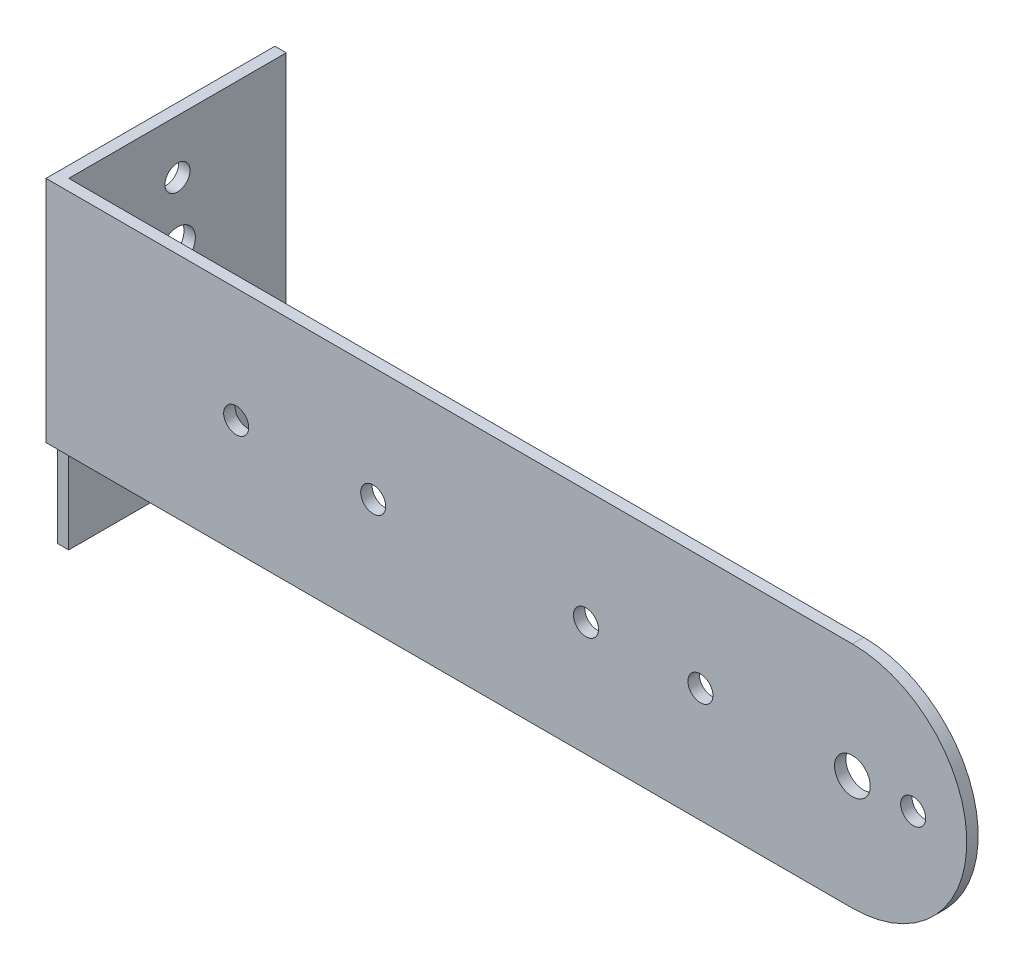
ISO-10303-21;
HEADER;
FILE_DESCRIPTION(('STEP AP214'),'2;1');
FILE_NAME('part.step','',(''),(''),'','','');
FILE_SCHEMA(('AUTOMOTIVE_DESIGN { 1 0 10303 214 1 1 1 1 }'));
ENDSEC;
DATA;
#1=APPLICATION_CONTEXT('core data for automotive mechanical design processes');
#2=APPLICATION_PROTOCOL_DEFINITION('international standard','automotive_design',2000,#1);
#3=PRODUCT_CONTEXT('',#1,'mechanical');
#4=PRODUCT('Part','Part','',(#3));
#5=PRODUCT_RELATED_PRODUCT_CATEGORY('part','',(#4));
#6=PRODUCT_DEFINITION_FORMATION('','',#4);
#7=PRODUCT_DEFINITION_CONTEXT('part definition',#1,'design');
#8=PRODUCT_DEFINITION('design','',#6,#7);
#9=PRODUCT_DEFINITION_SHAPE('','',#8);
#10=(LENGTH_UNIT() NAMED_UNIT(*) SI_UNIT(.MILLI.,.METRE.));
#11=(NAMED_UNIT(*) PLANE_ANGLE_UNIT() SI_UNIT($,.RADIAN.));
#12=(NAMED_UNIT(*) SI_UNIT($,.STERADIAN.) SOLID_ANGLE_UNIT());
#13=UNCERTAINTY_MEASURE_WITH_UNIT(LENGTH_MEASURE(1.E-05),#10,'distance_accuracy_value','');
#14=(GEOMETRIC_REPRESENTATION_CONTEXT(3) GLOBAL_UNCERTAINTY_ASSIGNED_CONTEXT((#13)) GLOBAL_UNIT_ASSIGNED_CONTEXT((#10,
#11,#12)) REPRESENTATION_CONTEXT('',''));
#15=CARTESIAN_POINT('',(0.,0.,0.));
#16=DIRECTION('',(0.,0.,1.));
#17=DIRECTION('',(1.,0.,0.));
#18=AXIS2_PLACEMENT_3D('',#15,#16,#17);
#19=CARTESIAN_POINT('',(0.,0.,0.));
#20=DIRECTION('',(0.,0.,1.));
#21=DIRECTION('',(1.,0.,0.));
#22=AXIS2_PLACEMENT_3D('',#19,#20,#21);
#23=PLANE('',#22);
#24=CARTESIAN_POINT('',(-37.25,0.,0.));
#25=DIRECTION('',(0.,0.,-1.));
#26=DIRECTION('',(-1.,0.,0.));
#27=AXIS2_PLACEMENT_3D('',#24,#25,#26);
#28=CIRCLE('',#27,1.75);
#29=CARTESIAN_POINT('',(-39.,0.,0.));
#30=VERTEX_POINT('',#29);
#31=EDGE_CURVE('E196',#30,#30,#28,.T.);
#32=ORIENTED_EDGE('',*,*,#31,.F.);
#33=EDGE_LOOP('',(#32));
#34=FACE_BOUND('',#33,.T.);
#35=CARTESIAN_POINT('',(-67.,0.,0.));
#36=DIRECTION('',(0.,0.,-1.));
#37=DIRECTION('',(-1.,0.,0.));
#38=AXIS2_PLACEMENT_3D('',#35,#36,#37);
#39=CIRCLE('',#38,1.75);
#40=CARTESIAN_POINT('',(-68.75,0.,0.));
#41=VERTEX_POINT('',#40);
#42=EDGE_CURVE('E202',#41,#41,#39,.T.);
#43=ORIENTED_EDGE('',*,*,#42,.F.);
#44=EDGE_LOOP('',(#43));
#45=FACE_BOUND('',#44,.T.);
#46=CARTESIAN_POINT('',(8.5,0.,0.));
#47=DIRECTION('',(0.,0.,-1.));
#48=DIRECTION('',(-1.,0.,0.));
#49=AXIS2_PLACEMENT_3D('',#46,#47,#48);
#50=CIRCLE('',#49,1.75);
#51=CARTESIAN_POINT('',(6.75,0.,0.));
#52=VERTEX_POINT('',#51);
#53=EDGE_CURVE('E208',#52,#52,#50,.T.);
#54=ORIENTED_EDGE('',*,*,#53,.F.);
#55=EDGE_LOOP('',(#54));
#56=FACE_BOUND('',#55,.T.);
#57=CARTESIAN_POINT('',(0.,0.,0.));
#58=DIRECTION('',(0.,0.,-1.));
#59=DIRECTION('',(-1.,0.,0.));
#60=AXIS2_PLACEMENT_3D('',#57,#58,#59);
#61=CIRCLE('',#60,2.5);
#62=CARTESIAN_POINT('',(-2.5,0.,0.));
#63=VERTEX_POINT('',#62);
#64=EDGE_CURVE('E214',#63,#63,#61,.T.);
#65=ORIENTED_EDGE('',*,*,#64,.F.);
#66=EDGE_LOOP('',(#65));
#67=FACE_BOUND('',#66,.T.);
#68=CARTESIAN_POINT('',(-21.25,0.,0.));
#69=DIRECTION('',(0.,0.,-1.));
#70=DIRECTION('',(-1.,0.,0.));
#71=AXIS2_PLACEMENT_3D('',#68,#69,#70);
#72=CIRCLE('',#71,1.75);
#73=CARTESIAN_POINT('',(-23.,0.,0.));
#74=VERTEX_POINT('',#73);
#75=EDGE_CURVE('E175',#74,#74,#72,.T.);
#76=ORIENTED_EDGE('',*,*,#75,.F.);
#77=EDGE_LOOP('',(#76));
#78=FACE_BOUND('',#77,.T.);
#79=CARTESIAN_POINT('',(-86.1600000000001,0.,0.));
#80=DIRECTION('',(0.,0.,-1.));
#81=DIRECTION('',(-1.,0.,0.));
#82=AXIS2_PLACEMENT_3D('',#79,#80,#81);
#83=CIRCLE('',#82,1.75);
#84=CARTESIAN_POINT('',(-87.9100000000001,0.,0.));
#85=VERTEX_POINT('',#84);
#86=EDGE_CURVE('E141',#85,#85,#83,.T.);
#87=ORIENTED_EDGE('',*,*,#86,.F.);
#88=EDGE_LOOP('',(#87));
#89=FACE_BOUND('',#88,.T.);
#90=DIRECTION('',(0.,-1.,0.));
#91=VECTOR('',#90,1.);
#92=CARTESIAN_POINT('',(-111.16,16.,0.));
#93=LINE('',#92,#91);
#94=CARTESIAN_POINT('',(-111.16,16.,0.));
#95=VERTEX_POINT('',#94);
#96=CARTESIAN_POINT('',(-111.16,-16.,0.));
#97=VERTEX_POINT('',#96);
#98=EDGE_CURVE('E60',#95,#97,#93,.T.);
#99=ORIENTED_EDGE('',*,*,#98,.F.);
#100=DIRECTION('',(-1.,0.,0.));
#101=VECTOR('',#100,1.);
#102=CARTESIAN_POINT('',(0.,16.,0.));
#103=LINE('',#102,#101);
#104=CARTESIAN_POINT('',(0.,16.,0.));
#105=VERTEX_POINT('',#104);
#106=EDGE_CURVE('E168',#105,#95,#103,.T.);
#107=ORIENTED_EDGE('',*,*,#106,.F.);
#108=CARTESIAN_POINT('',(0.,0.,0.));
#109=DIRECTION('',(0.,0.,1.));
#110=DIRECTION('',(1.,0.,0.));
#111=AXIS2_PLACEMENT_3D('',#108,#109,#110);
#112=CIRCLE('',#111,16.);
#113=CARTESIAN_POINT('',(0.,-16.,0.));
#114=VERTEX_POINT('',#113);
#115=EDGE_CURVE('E158',#114,#105,#112,.T.);
#116=ORIENTED_EDGE('',*,*,#115,.F.);
#117=DIRECTION('',(1.,0.,0.));
#118=VECTOR('',#117,1.);
#119=CARTESIAN_POINT('',(-112.75,-16.,0.));
#120=LINE('',#119,#118);
#121=EDGE_CURVE('E85',#97,#114,#120,.T.);
#122=ORIENTED_EDGE('',*,*,#121,.F.);
#123=EDGE_LOOP('',(#99,#107,#116,#122));
#124=FACE_BOUND('',#123,.T.);
#125=ADVANCED_FACE('F43',(#34,#45,#56,#67,#78,#89,#124),#23,.F.);
#126=CARTESIAN_POINT('',(0.,0.,1.59));
#127=DIRECTION('',(0.,0.,-1.));
#128=DIRECTION('',(-1.,0.,0.));
#129=AXIS2_PLACEMENT_3D('',#126,#127,#128);
#130=CYLINDRICAL_SURFACE('',#129,16.);
#131=ORIENTED_EDGE('',*,*,#115,.T.);
#132=DIRECTION('',(0.,0.,-1.));
#133=VECTOR('',#132,1.);
#134=CARTESIAN_POINT('',(0.,16.,1.59));
#135=LINE('',#134,#133);
#136=CARTESIAN_POINT('',(0.,16.,1.59));
#137=VERTEX_POINT('',#136);
#138=EDGE_CURVE('E13',#137,#105,#135,.T.);
#139=ORIENTED_EDGE('',*,*,#138,.F.);
#140=CARTESIAN_POINT('',(0.,0.,1.59));
#141=DIRECTION('',(0.,0.,1.));
#142=DIRECTION('',(1.,0.,0.));
#143=AXIS2_PLACEMENT_3D('',#140,#141,#142);
#144=CIRCLE('',#143,16.);
#145=CARTESIAN_POINT('',(0.,-16.,1.59));
#146=VERTEX_POINT('',#145);
#147=EDGE_CURVE('E159',#146,#137,#144,.T.);
#148=ORIENTED_EDGE('',*,*,#147,.F.);
#149=DIRECTION('',(0.,0.,-1.));
#150=VECTOR('',#149,1.);
#151=CARTESIAN_POINT('',(0.,-16.,1.59));
#152=LINE('',#151,#150);
#153=EDGE_CURVE('E165',#146,#114,#152,.T.);
#154=ORIENTED_EDGE('',*,*,#153,.T.);
#155=EDGE_LOOP('',(#131,#139,#148,#154));
#156=FACE_BOUND('',#155,.T.);
#157=ADVANCED_FACE('F45',(#156),#130,.T.);
#158=CARTESIAN_POINT('',(0.,16.,1.59));
#159=DIRECTION('',(0.,-1.,0.));
#160=DIRECTION('',(0.,0.,-1.));
#161=AXIS2_PLACEMENT_3D('',#158,#159,#160);
#162=PLANE('',#161);
#163=ORIENTED_EDGE('',*,*,#106,.T.);
#164=DIRECTION('',(0.,0.,1.));
#165=VECTOR('',#164,1.);
#166=CARTESIAN_POINT('',(-111.16,16.,-30.41));
#167=LINE('',#166,#165);
#168=CARTESIAN_POINT('',(-111.16,16.,-30.41));
#169=VERTEX_POINT('',#168);
#170=EDGE_CURVE('E128',#169,#95,#167,.T.);
#171=ORIENTED_EDGE('',*,*,#170,.F.);
#172=DIRECTION('',(1.,0.,0.));
#173=VECTOR('',#172,1.);
#174=CARTESIAN_POINT('',(-112.75,16.,-30.41));
#175=LINE('',#174,#173);
#176=CARTESIAN_POINT('',(-112.75,16.,-30.41));
#177=VERTEX_POINT('',#176);
#178=EDGE_CURVE('E125',#177,#169,#175,.T.);
#179=ORIENTED_EDGE('',*,*,#178,.F.);
#180=DIRECTION('',(0.,0.,-1.));
#181=VECTOR('',#180,1.);
#182=CARTESIAN_POINT('',(-112.75,16.,1.59));
#183=LINE('',#182,#181);
#184=CARTESIAN_POINT('',(-112.75,16.,1.59));
#185=VERTEX_POINT('',#184);
#186=EDGE_CURVE('E52',#185,#177,#183,.T.);
#187=ORIENTED_EDGE('',*,*,#186,.F.);
#188=DIRECTION('',(-1.,0.,0.));
#189=VECTOR('',#188,1.);
#190=CARTESIAN_POINT('',(0.,16.,1.59));
#191=LINE('',#190,#189);
#192=EDGE_CURVE('E92',#137,#185,#191,.T.);
#193=ORIENTED_EDGE('',*,*,#192,.F.);
#194=ORIENTED_EDGE('',*,*,#138,.T.);
#195=EDGE_LOOP('',(#163,#171,#179,#187,#193,#194));
#196=FACE_BOUND('',#195,.T.);
#197=ADVANCED_FACE('F126',(#196),#162,.F.);
#198=CARTESIAN_POINT('',(-112.75,16.,1.59));
#199=DIRECTION('',(1.,0.,0.));
#200=DIRECTION('',(0.,0.,-1.));
#201=AXIS2_PLACEMENT_3D('',#198,#199,#200);
#202=PLANE('',#201);
#203=CARTESIAN_POINT('',(-112.75,8.5,-15.205));
#204=DIRECTION('',(-1.,0.,0.));
#205=DIRECTION('',(0.,0.,1.));
#206=AXIS2_PLACEMENT_3D('',#203,#204,#205);
#207=CIRCLE('',#206,1.75);
#208=CARTESIAN_POINT('',(-112.75,8.5,-13.455));
#209=VERTEX_POINT('',#208);
#210=EDGE_CURVE('E179',#209,#209,#207,.T.);
#211=ORIENTED_EDGE('',*,*,#210,.F.);
#212=EDGE_LOOP('',(#211));
#213=FACE_BOUND('',#212,.T.);
#214=CARTESIAN_POINT('',(-112.75,-21.25,-15.205));
#215=DIRECTION('',(-1.,0.,0.));
#216=DIRECTION('',(0.,0.,1.));
#217=AXIS2_PLACEMENT_3D('',#214,#215,#216);
#218=CIRCLE('',#217,1.75);
#219=CARTESIAN_POINT('',(-112.75,-21.25,-13.455));
#220=VERTEX_POINT('',#219);
#221=EDGE_CURVE('E184',#220,#220,#218,.T.);
#222=ORIENTED_EDGE('',*,*,#221,.F.);
#223=EDGE_LOOP('',(#222));
#224=FACE_BOUND('',#223,.T.);
#225=CARTESIAN_POINT('',(-112.75,0.,-15.205));
#226=DIRECTION('',(-1.,0.,0.));
#227=DIRECTION('',(0.,0.,1.));
#228=AXIS2_PLACEMENT_3D('',#225,#226,#227);
#229=CIRCLE('',#228,2.5);
#230=CARTESIAN_POINT('',(-112.75,0.,-12.705));
#231=VERTEX_POINT('',#230);
#232=EDGE_CURVE('E176',#231,#231,#229,.T.);
#233=ORIENTED_EDGE('',*,*,#232,.F.);
#234=EDGE_LOOP('',(#233));
#235=FACE_BOUND('',#234,.T.);
#236=ORIENTED_EDGE('',*,*,#186,.T.);
#237=DIRECTION('',(0.,1.,0.));
#238=VECTOR('',#237,1.);
#239=CARTESIAN_POINT('',(-112.75,16.,-30.41));
#240=LINE('',#239,#238);
#241=CARTESIAN_POINT('',(-112.75,-29.,-30.41));
#242=VERTEX_POINT('',#241);
#243=EDGE_CURVE('E119',#242,#177,#240,.T.);
#244=ORIENTED_EDGE('',*,*,#243,.F.);
#245=DIRECTION('',(0.,0.,1.));
#246=VECTOR('',#245,1.);
#247=CARTESIAN_POINT('',(-112.75,-29.,-30.41));
#248=LINE('',#247,#246);
#249=CARTESIAN_POINT('',(-112.75,-29.,0.));
#250=VERTEX_POINT('',#249);
#251=EDGE_CURVE('E146',#242,#250,#248,.T.);
#252=ORIENTED_EDGE('',*,*,#251,.T.);
#253=DIRECTION('',(0.,1.,0.));
#254=VECTOR('',#253,1.);
#255=CARTESIAN_POINT('',(-112.75,16.,0.));
#256=LINE('',#255,#254);
#257=CARTESIAN_POINT('',(-112.75,-16.,0.));
#258=VERTEX_POINT('',#257);
#259=EDGE_CURVE('E147',#250,#258,#256,.T.);
#260=ORIENTED_EDGE('',*,*,#259,.T.);
#261=DIRECTION('',(0.,0.,-1.));
#262=VECTOR('',#261,1.);
#263=CARTESIAN_POINT('',(-112.75,-16.,1.59));
#264=LINE('',#263,#262);
#265=CARTESIAN_POINT('',(-112.75,-16.,1.59));
#266=VERTEX_POINT('',#265);
#267=EDGE_CURVE('E122',#266,#258,#264,.T.);
#268=ORIENTED_EDGE('',*,*,#267,.F.);
#269=DIRECTION('',(0.,-1.,0.));
#270=VECTOR('',#269,1.);
#271=CARTESIAN_POINT('',(-112.75,16.,1.59));
#272=LINE('',#271,#270);
#273=EDGE_CURVE('E121',#185,#266,#272,.T.);
#274=ORIENTED_EDGE('',*,*,#273,.F.);
#275=EDGE_LOOP('',(#236,#244,#252,#260,#268,#274));
#276=FACE_BOUND('',#275,.T.);
#277=ADVANCED_FACE('F116',(#213,#224,#235,#276),#202,.F.);
#278=CARTESIAN_POINT('',(-112.75,-16.,1.59));
#279=DIRECTION('',(0.,1.,0.));
#280=DIRECTION('',(0.,0.,1.));
#281=AXIS2_PLACEMENT_3D('',#278,#279,#280);
#282=PLANE('',#281);
#283=EDGE_CURVE('E161',#258,#97,#120,.T.);
#284=ORIENTED_EDGE('',*,*,#283,.T.);
#285=ORIENTED_EDGE('',*,*,#121,.T.);
#286=ORIENTED_EDGE('',*,*,#153,.F.);
#287=DIRECTION('',(1.,0.,0.));
#288=VECTOR('',#287,1.);
#289=CARTESIAN_POINT('',(-112.75,-16.,1.59));
#290=LINE('',#289,#288);
#291=EDGE_CURVE('E69',#266,#146,#290,.T.);
#292=ORIENTED_EDGE('',*,*,#291,.F.);
#293=ORIENTED_EDGE('',*,*,#267,.T.);
#294=EDGE_LOOP('',(#284,#285,#286,#292,#293));
#295=FACE_BOUND('',#294,.T.);
#296=ADVANCED_FACE('F242',(#295),#282,.F.);
#297=CARTESIAN_POINT('',(0.,0.,1.59));
#298=DIRECTION('',(0.,0.,1.));
#299=DIRECTION('',(1.,0.,0.));
#300=AXIS2_PLACEMENT_3D('',#297,#298,#299);
#301=PLANE('',#300);
#302=CARTESIAN_POINT('',(-37.25,0.,1.59));
#303=DIRECTION('',(0.,0.,-1.));
#304=DIRECTION('',(-1.,0.,0.));
#305=AXIS2_PLACEMENT_3D('',#302,#303,#304);
#306=CIRCLE('',#305,1.75);
#307=CARTESIAN_POINT('',(-39.,0.,1.59));
#308=VERTEX_POINT('',#307);
#309=EDGE_CURVE('E193',#308,#308,#306,.T.);
#310=ORIENTED_EDGE('',*,*,#309,.T.);
#311=EDGE_LOOP('',(#310));
#312=FACE_BOUND('',#311,.T.);
#313=CARTESIAN_POINT('',(-67.,0.,1.59));
#314=DIRECTION('',(0.,0.,-1.));
#315=DIRECTION('',(-1.,0.,0.));
#316=AXIS2_PLACEMENT_3D('',#313,#314,#315);
#317=CIRCLE('',#316,1.75);
#318=CARTESIAN_POINT('',(-68.75,0.,1.59));
#319=VERTEX_POINT('',#318);
#320=EDGE_CURVE('E199',#319,#319,#317,.T.);
#321=ORIENTED_EDGE('',*,*,#320,.T.);
#322=EDGE_LOOP('',(#321));
#323=FACE_BOUND('',#322,.T.);
#324=CARTESIAN_POINT('',(8.5,0.,1.59));
#325=DIRECTION('',(0.,0.,-1.));
#326=DIRECTION('',(-1.,0.,0.));
#327=AXIS2_PLACEMENT_3D('',#324,#325,#326);
#328=CIRCLE('',#327,1.75);
#329=CARTESIAN_POINT('',(6.75,0.,1.59));
#330=VERTEX_POINT('',#329);
#331=EDGE_CURVE('E205',#330,#330,#328,.T.);
#332=ORIENTED_EDGE('',*,*,#331,.T.);
#333=EDGE_LOOP('',(#332));
#334=FACE_BOUND('',#333,.T.);
#335=CARTESIAN_POINT('',(0.,0.,1.59));
#336=DIRECTION('',(0.,0.,-1.));
#337=DIRECTION('',(-1.,0.,0.));
#338=AXIS2_PLACEMENT_3D('',#335,#336,#337);
#339=CIRCLE('',#338,2.5);
#340=CARTESIAN_POINT('',(-2.5,0.,1.59));
#341=VERTEX_POINT('',#340);
#342=EDGE_CURVE('E211',#341,#341,#339,.T.);
#343=ORIENTED_EDGE('',*,*,#342,.T.);
#344=EDGE_LOOP('',(#343));
#345=FACE_BOUND('',#344,.T.);
#346=CARTESIAN_POINT('',(-21.25,0.,1.59));
#347=DIRECTION('',(0.,0.,-1.));
#348=DIRECTION('',(-1.,0.,0.));
#349=AXIS2_PLACEMENT_3D('',#346,#347,#348);
#350=CIRCLE('',#349,1.75);
#351=CARTESIAN_POINT('',(-23.,0.,1.59));
#352=VERTEX_POINT('',#351);
#353=EDGE_CURVE('E217',#352,#352,#350,.T.);
#354=ORIENTED_EDGE('',*,*,#353,.T.);
#355=EDGE_LOOP('',(#354));
#356=FACE_BOUND('',#355,.T.);
#357=CARTESIAN_POINT('',(-86.1600000000001,0.,1.59));
#358=DIRECTION('',(0.,0.,-1.));
#359=DIRECTION('',(-1.,0.,0.));
#360=AXIS2_PLACEMENT_3D('',#357,#358,#359);
#361=CIRCLE('',#360,1.75);
#362=CARTESIAN_POINT('',(-87.9100000000001,0.,1.59));
#363=VERTEX_POINT('',#362);
#364=EDGE_CURVE('E151',#363,#363,#361,.T.);
#365=ORIENTED_EDGE('',*,*,#364,.T.);
#366=EDGE_LOOP('',(#365));
#367=FACE_BOUND('',#366,.T.);
#368=ORIENTED_EDGE('',*,*,#147,.T.);
#369=ORIENTED_EDGE('',*,*,#192,.T.);
#370=ORIENTED_EDGE('',*,*,#273,.T.);
#371=ORIENTED_EDGE('',*,*,#291,.T.);
#372=EDGE_LOOP('',(#368,#369,#370,#371));
#373=FACE_BOUND('',#372,.T.);
#374=ADVANCED_FACE('F240',(#312,#323,#334,#345,#356,#367,#373),#301,.T.);
#375=CARTESIAN_POINT('',(0.,0.,0.));
#376=DIRECTION('',(0.,0.,1.));
#377=DIRECTION('',(1.,0.,0.));
#378=AXIS2_PLACEMENT_3D('',#375,#376,#377);
#379=PLANE('',#378);
#380=ORIENTED_EDGE('',*,*,#283,.F.);
#381=ORIENTED_EDGE('',*,*,#259,.F.);
#382=DIRECTION('',(-1.,0.,0.));
#383=VECTOR('',#382,1.);
#384=CARTESIAN_POINT('',(-112.75,-29.,0.));
#385=LINE('',#384,#383);
#386=CARTESIAN_POINT('',(-111.16,-29.,0.));
#387=VERTEX_POINT('',#386);
#388=EDGE_CURVE('E137',#387,#250,#385,.T.);
#389=ORIENTED_EDGE('',*,*,#388,.F.);
#390=EDGE_CURVE('E150',#97,#387,#93,.T.);
#391=ORIENTED_EDGE('',*,*,#390,.F.);
#392=EDGE_LOOP('',(#380,#381,#389,#391));
#393=FACE_BOUND('',#392,.T.);
#394=ADVANCED_FACE('F269',(#393),#379,.T.);
#395=CARTESIAN_POINT('',(-111.16,16.,-30.41));
#396=DIRECTION('',(-1.,0.,0.));
#397=DIRECTION('',(0.,-1.,0.));
#398=AXIS2_PLACEMENT_3D('',#395,#396,#397);
#399=PLANE('',#398);
#400=CARTESIAN_POINT('',(-111.16,8.5,-15.205));
#401=DIRECTION('',(-1.,0.,0.));
#402=DIRECTION('',(0.,-1.,0.));
#403=AXIS2_PLACEMENT_3D('',#400,#401,#402);
#404=CIRCLE('',#403,1.75);
#405=CARTESIAN_POINT('',(-111.16,6.75,-15.205));
#406=VERTEX_POINT('',#405);
#407=EDGE_CURVE('E47',#406,#406,#404,.T.);
#408=ORIENTED_EDGE('',*,*,#407,.T.);
#409=EDGE_LOOP('',(#408));
#410=FACE_BOUND('',#409,.T.);
#411=CARTESIAN_POINT('',(-111.16,-21.25,-15.205));
#412=DIRECTION('',(-1.,0.,0.));
#413=DIRECTION('',(0.,-1.,0.));
#414=AXIS2_PLACEMENT_3D('',#411,#412,#413);
#415=CIRCLE('',#414,1.75);
#416=CARTESIAN_POINT('',(-111.16,-23.,-15.205));
#417=VERTEX_POINT('',#416);
#418=EDGE_CURVE('E177',#417,#417,#415,.T.);
#419=ORIENTED_EDGE('',*,*,#418,.T.);
#420=EDGE_LOOP('',(#419));
#421=FACE_BOUND('',#420,.T.);
#422=CARTESIAN_POINT('',(-111.16,0.,-15.205));
#423=DIRECTION('',(-1.,0.,0.));
#424=DIRECTION('',(0.,-1.,0.));
#425=AXIS2_PLACEMENT_3D('',#422,#423,#424);
#426=CIRCLE('',#425,2.5);
#427=CARTESIAN_POINT('',(-111.16,-2.5,-15.205));
#428=VERTEX_POINT('',#427);
#429=EDGE_CURVE('E173',#428,#428,#426,.T.);
#430=ORIENTED_EDGE('',*,*,#429,.T.);
#431=EDGE_LOOP('',(#430));
#432=FACE_BOUND('',#431,.T.);
#433=ORIENTED_EDGE('',*,*,#98,.T.);
#434=ORIENTED_EDGE('',*,*,#390,.T.);
#435=DIRECTION('',(0.,0.,1.));
#436=VECTOR('',#435,1.);
#437=CARTESIAN_POINT('',(-111.16,-29.,-30.41));
#438=LINE('',#437,#436);
#439=CARTESIAN_POINT('',(-111.16,-29.,-30.41));
#440=VERTEX_POINT('',#439);
#441=EDGE_CURVE('E154',#440,#387,#438,.T.);
#442=ORIENTED_EDGE('',*,*,#441,.F.);
#443=DIRECTION('',(0.,-1.,0.));
#444=VECTOR('',#443,1.);
#445=CARTESIAN_POINT('',(-111.16,16.,-30.41));
#446=LINE('',#445,#444);
#447=EDGE_CURVE('E131',#169,#440,#446,.T.);
#448=ORIENTED_EDGE('',*,*,#447,.F.);
#449=ORIENTED_EDGE('',*,*,#170,.T.);
#450=EDGE_LOOP('',(#433,#434,#442,#448,#449));
#451=FACE_BOUND('',#450,.T.);
#452=ADVANCED_FACE('F276',(#410,#421,#432,#451),#399,.F.);
#453=CARTESIAN_POINT('',(-112.75,-29.,-30.41));
#454=DIRECTION('',(0.,1.,0.));
#455=DIRECTION('',(0.,0.,1.));
#456=AXIS2_PLACEMENT_3D('',#453,#454,#455);
#457=PLANE('',#456);
#458=ORIENTED_EDGE('',*,*,#388,.T.);
#459=ORIENTED_EDGE('',*,*,#251,.F.);
#460=DIRECTION('',(-1.,0.,0.));
#461=VECTOR('',#460,1.);
#462=CARTESIAN_POINT('',(-112.75,-29.,-30.41));
#463=LINE('',#462,#461);
#464=EDGE_CURVE('E135',#440,#242,#463,.T.);
#465=ORIENTED_EDGE('',*,*,#464,.F.);
#466=ORIENTED_EDGE('',*,*,#441,.T.);
#467=EDGE_LOOP('',(#458,#459,#465,#466));
#468=FACE_BOUND('',#467,.T.);
#469=ADVANCED_FACE('F284',(#468),#457,.F.);
#470=CARTESIAN_POINT('',(0.,0.,-30.41));
#471=DIRECTION('',(0.,0.,1.));
#472=DIRECTION('',(1.,0.,0.));
#473=AXIS2_PLACEMENT_3D('',#470,#471,#472);
#474=PLANE('',#473);
#475=ORIENTED_EDGE('',*,*,#243,.T.);
#476=ORIENTED_EDGE('',*,*,#178,.T.);
#477=ORIENTED_EDGE('',*,*,#447,.T.);
#478=ORIENTED_EDGE('',*,*,#464,.T.);
#479=EDGE_LOOP('',(#475,#476,#477,#478));
#480=FACE_BOUND('',#479,.T.);
#481=ADVANCED_FACE('F133',(#480),#474,.F.);
#482=CARTESIAN_POINT('',(-86.1600000000001,0.,1.59));
#483=DIRECTION('',(0.,0.,-1.));
#484=DIRECTION('',(-1.,0.,0.));
#485=AXIS2_PLACEMENT_3D('',#482,#483,#484);
#486=CYLINDRICAL_SURFACE('',#485,1.75);
#487=CARTESIAN_POINT('',(-87.9100000000001,0.,1.59));
#488=CARTESIAN_POINT('',(-87.9100000000001,0.,1.5734375));
#489=CARTESIAN_POINT('',(-87.9100000000001,0.,1.556875));
#490=CARTESIAN_POINT('',(-87.9100000000001,0.,1.52375));
#491=CARTESIAN_POINT('',(-87.9100000000001,0.,1.5071875));
#492=CARTESIAN_POINT('',(-87.9100000000001,0.,1.4740625));
#493=CARTESIAN_POINT('',(-87.9100000000001,0.,1.4575));
#494=CARTESIAN_POINT('',(-87.9100000000001,0.,1.424375));
#495=CARTESIAN_POINT('',(-87.9100000000001,0.,1.4078125));
#496=CARTESIAN_POINT('',(-87.9100000000001,0.,1.3746875));
#497=CARTESIAN_POINT('',(-87.9100000000001,0.,1.358125));
#498=CARTESIAN_POINT('',(-87.9100000000001,0.,1.325));
#499=CARTESIAN_POINT('',(-87.9100000000001,0.,1.3084375));
#500=CARTESIAN_POINT('',(-87.9100000000001,0.,1.2753125));
#501=CARTESIAN_POINT('',(-87.9100000000001,0.,1.25875));
#502=CARTESIAN_POINT('',(-87.9100000000001,0.,1.225625));
#503=CARTESIAN_POINT('',(-87.9100000000001,0.,1.2090625));
#504=CARTESIAN_POINT('',(-87.9100000000001,0.,1.1759375));
#505=CARTESIAN_POINT('',(-87.9100000000001,0.,1.159375));
#506=CARTESIAN_POINT('',(-87.9100000000001,0.,1.12625));
#507=CARTESIAN_POINT('',(-87.9100000000001,0.,1.1096875));
#508=CARTESIAN_POINT('',(-87.9100000000001,0.,1.0765625));
#509=CARTESIAN_POINT('',(-87.9100000000001,0.,1.06));
#510=CARTESIAN_POINT('',(-87.9100000000001,0.,1.026875));
#511=CARTESIAN_POINT('',(-87.9100000000001,0.,1.0103125));
#512=CARTESIAN_POINT('',(-87.9100000000001,0.,0.9771875));
#513=CARTESIAN_POINT('',(-87.9100000000001,0.,0.960625));
#514=CARTESIAN_POINT('',(-87.9100000000001,0.,0.9275));
#515=CARTESIAN_POINT('',(-87.9100000000001,0.,0.9109375));
#516=CARTESIAN_POINT('',(-87.9100000000001,0.,0.8778125));
#517=CARTESIAN_POINT('',(-87.9100000000001,0.,0.86125));
#518=CARTESIAN_POINT('',(-87.9100000000001,0.,0.828125));
#519=CARTESIAN_POINT('',(-87.9100000000001,0.,0.8115625));
#520=CARTESIAN_POINT('',(-87.9100000000001,0.,0.7784375));
#521=CARTESIAN_POINT('',(-87.9100000000001,0.,0.761875));
#522=CARTESIAN_POINT('',(-87.9100000000001,0.,0.72875));
#523=CARTESIAN_POINT('',(-87.9100000000001,0.,0.7121875));
#524=CARTESIAN_POINT('',(-87.9100000000001,0.,0.6790625));
#525=CARTESIAN_POINT('',(-87.9100000000001,0.,0.6625));
#526=CARTESIAN_POINT('',(-87.9100000000001,0.,0.629375));
#527=CARTESIAN_POINT('',(-87.9100000000001,0.,0.6128125));
#528=CARTESIAN_POINT('',(-87.9100000000001,0.,0.5796875));
#529=CARTESIAN_POINT('',(-87.9100000000001,0.,0.563125));
#530=CARTESIAN_POINT('',(-87.9100000000001,0.,0.53));
#531=CARTESIAN_POINT('',(-87.9100000000001,0.,0.5134375));
#532=CARTESIAN_POINT('',(-87.9100000000001,0.,0.4803125));
#533=CARTESIAN_POINT('',(-87.9100000000001,0.,0.46375));
#534=CARTESIAN_POINT('',(-87.9100000000001,0.,0.430625));
#535=CARTESIAN_POINT('',(-87.9100000000001,0.,0.4140625));
#536=CARTESIAN_POINT('',(-87.9100000000001,0.,0.3809375));
#537=CARTESIAN_POINT('',(-87.9100000000001,0.,0.364375));
#538=CARTESIAN_POINT('',(-87.9100000000001,0.,0.33125));
#539=CARTESIAN_POINT('',(-87.9100000000001,0.,0.3146875));
#540=CARTESIAN_POINT('',(-87.9100000000001,0.,0.2815625));
#541=CARTESIAN_POINT('',(-87.9100000000001,0.,0.265));
#542=CARTESIAN_POINT('',(-87.9100000000001,0.,0.231875));
#543=CARTESIAN_POINT('',(-87.9100000000001,0.,0.2153125));
#544=CARTESIAN_POINT('',(-87.9100000000001,0.,0.1821875));
#545=CARTESIAN_POINT('',(-87.9100000000001,0.,0.165625));
#546=CARTESIAN_POINT('',(-87.9100000000001,0.,0.1325));
#547=CARTESIAN_POINT('',(-87.9100000000001,0.,0.1159375));
#548=CARTESIAN_POINT('',(-87.9100000000001,0.,0.0828125000000001));
#549=CARTESIAN_POINT('',(-87.9100000000001,0.,0.06625));
#550=CARTESIAN_POINT('',(-87.9100000000001,0.,0.033125));
#551=CARTESIAN_POINT('',(-87.9100000000001,0.,0.0165625));
#552=CARTESIAN_POINT('',(-87.9100000000001,0.,0.));
#553=B_SPLINE_CURVE_WITH_KNOTS('',3,(#487,#488,#489,#490,#491,#492,#493,#494,#495,#496,#497,
#498,#499,#500,#501,#502,#503,#504,#505,#506,#507,#508,#509,#510,#511,#512,#513,#514,#515,#516,
#517,#518,#519,#520,#521,#522,#523,#524,#525,#526,#527,#528,#529,#530,#531,#532,#533,#534,#535,
#536,#537,#538,#539,#540,#541,#542,#543,#544,#545,#546,#547,#548,#549,#550,#551,#552),
.UNSPECIFIED.,.F.,.F.,(4,2,2,2,2,2,2,2,2,2,2,2,2,2,2,2,2,2,2,2,2,2,2,2,2,2,2,2,2,2,2,2,4),(0.,
0.0496875,0.0993750000000001,0.1490625,0.19875,0.2484375,0.298125,0.3478125,0.3975,0.4471875,
0.496875,0.5465625,0.59625,0.6459375,0.695625,0.7453125,0.795,0.8446875,0.894375,0.9440625,
0.99375,1.0434375,1.093125,1.1428125,1.1925,1.2421875,1.291875,1.3415625,1.39125,1.4409375,
1.490625,1.5403125,1.59),.UNSPECIFIED.);
#554=EDGE_CURVE('BSEAM227',#363,#85,#553,.T.);
#555=ORIENTED_EDGE('',*,*,#364,.F.);
#556=ORIENTED_EDGE('',*,*,#86,.T.);
#557=ORIENTED_EDGE('',*,*,#554,.T.);
#558=ORIENTED_EDGE('',*,*,#554,.F.);
#559=EDGE_LOOP('',(#555,#557,#556,#558));
#560=FACE_BOUND('',#559,.T.);
#561=ADVANCED_FACE('F227',(#560),#486,.F.);
#562=CARTESIAN_POINT('',(-21.25,0.,1.59));
#563=DIRECTION('',(0.,0.,-1.));
#564=DIRECTION('',(-1.,0.,0.));
#565=AXIS2_PLACEMENT_3D('',#562,#563,#564);
#566=CYLINDRICAL_SURFACE('',#565,1.75);
#567=CARTESIAN_POINT('',(-23.,0.,1.59));
#568=CARTESIAN_POINT('',(-23.,0.,1.5734375));
#569=CARTESIAN_POINT('',(-23.,0.,1.556875));
#570=CARTESIAN_POINT('',(-23.,0.,1.52375));
#571=CARTESIAN_POINT('',(-23.,0.,1.5071875));
#572=CARTESIAN_POINT('',(-23.,0.,1.4740625));
#573=CARTESIAN_POINT('',(-23.,0.,1.4575));
#574=CARTESIAN_POINT('',(-23.,0.,1.424375));
#575=CARTESIAN_POINT('',(-23.,0.,1.4078125));
#576=CARTESIAN_POINT('',(-23.,0.,1.3746875));
#577=CARTESIAN_POINT('',(-23.,0.,1.358125));
#578=CARTESIAN_POINT('',(-23.,0.,1.325));
#579=CARTESIAN_POINT('',(-23.,0.,1.3084375));
#580=CARTESIAN_POINT('',(-23.,0.,1.2753125));
#581=CARTESIAN_POINT('',(-23.,0.,1.25875));
#582=CARTESIAN_POINT('',(-23.,0.,1.225625));
#583=CARTESIAN_POINT('',(-23.,0.,1.2090625));
#584=CARTESIAN_POINT('',(-23.,0.,1.1759375));
#585=CARTESIAN_POINT('',(-23.,0.,1.159375));
#586=CARTESIAN_POINT('',(-23.,0.,1.12625));
#587=CARTESIAN_POINT('',(-23.,0.,1.1096875));
#588=CARTESIAN_POINT('',(-23.,0.,1.0765625));
#589=CARTESIAN_POINT('',(-23.,0.,1.06));
#590=CARTESIAN_POINT('',(-23.,0.,1.026875));
#591=CARTESIAN_POINT('',(-23.,0.,1.0103125));
#592=CARTESIAN_POINT('',(-23.,0.,0.9771875));
#593=CARTESIAN_POINT('',(-23.,0.,0.960625));
#594=CARTESIAN_POINT('',(-23.,0.,0.9275));
#595=CARTESIAN_POINT('',(-23.,0.,0.9109375));
#596=CARTESIAN_POINT('',(-23.,0.,0.8778125));
#597=CARTESIAN_POINT('',(-23.,0.,0.86125));
#598=CARTESIAN_POINT('',(-23.,0.,0.828125));
#599=CARTESIAN_POINT('',(-23.,0.,0.8115625));
#600=CARTESIAN_POINT('',(-23.,0.,0.7784375));
#601=CARTESIAN_POINT('',(-23.,0.,0.761875));
#602=CARTESIAN_POINT('',(-23.,0.,0.72875));
#603=CARTESIAN_POINT('',(-23.,0.,0.7121875));
#604=CARTESIAN_POINT('',(-23.,0.,0.6790625));
#605=CARTESIAN_POINT('',(-23.,0.,0.6625));
#606=CARTESIAN_POINT('',(-23.,0.,0.629375));
#607=CARTESIAN_POINT('',(-23.,0.,0.6128125));
#608=CARTESIAN_POINT('',(-23.,0.,0.5796875));
#609=CARTESIAN_POINT('',(-23.,0.,0.563125));
#610=CARTESIAN_POINT('',(-23.,0.,0.53));
#611=CARTESIAN_POINT('',(-23.,0.,0.5134375));
#612=CARTESIAN_POINT('',(-23.,0.,0.4803125));
#613=CARTESIAN_POINT('',(-23.,0.,0.46375));
#614=CARTESIAN_POINT('',(-23.,0.,0.430625));
#615=CARTESIAN_POINT('',(-23.,0.,0.4140625));
#616=CARTESIAN_POINT('',(-23.,0.,0.3809375));
#617=CARTESIAN_POINT('',(-23.,0.,0.364375));
#618=CARTESIAN_POINT('',(-23.,0.,0.33125));
#619=CARTESIAN_POINT('',(-23.,0.,0.3146875));
#620=CARTESIAN_POINT('',(-23.,0.,0.2815625));
#621=CARTESIAN_POINT('',(-23.,0.,0.265));
#622=CARTESIAN_POINT('',(-23.,0.,0.231875));
#623=CARTESIAN_POINT('',(-23.,0.,0.2153125));
#624=CARTESIAN_POINT('',(-23.,0.,0.1821875));
#625=CARTESIAN_POINT('',(-23.,0.,0.165625));
#626=CARTESIAN_POINT('',(-23.,0.,0.1325));
#627=CARTESIAN_POINT('',(-23.,0.,0.1159375));
#628=CARTESIAN_POINT('',(-23.,0.,0.0828125000000001));
#629=CARTESIAN_POINT('',(-23.,0.,0.06625));
#630=CARTESIAN_POINT('',(-23.,0.,0.033125));
#631=CARTESIAN_POINT('',(-23.,0.,0.0165625));
#632=CARTESIAN_POINT('',(-23.,0.,0.));
#633=B_SPLINE_CURVE_WITH_KNOTS('',3,(#567,#568,#569,#570,#571,#572,#573,#574,#575,#576,#577,
#578,#579,#580,#581,#582,#583,#584,#585,#586,#587,#588,#589,#590,#591,#592,#593,#594,#595,#596,
#597,#598,#599,#600,#601,#602,#603,#604,#605,#606,#607,#608,#609,#610,#611,#612,#613,#614,#615,
#616,#617,#618,#619,#620,#621,#622,#623,#624,#625,#626,#627,#628,#629,#630,#631,#632),
.UNSPECIFIED.,.F.,.F.,(4,2,2,2,2,2,2,2,2,2,2,2,2,2,2,2,2,2,2,2,2,2,2,2,2,2,2,2,2,2,2,2,4),(0.,
0.0496875,0.0993750000000001,0.1490625,0.19875,0.2484375,0.298125,0.3478125,0.3975,0.4471875,
0.496875,0.5465625,0.59625,0.6459375,0.695625,0.7453125,0.795,0.8446875,0.894375,0.9440625,
0.99375,1.0434375,1.093125,1.1428125,1.1925,1.2421875,1.291875,1.3415625,1.39125,1.4409375,
1.490625,1.5403125,1.59),.UNSPECIFIED.);
#634=EDGE_CURVE('BSEAM303',#352,#74,#633,.T.);
#635=ORIENTED_EDGE('',*,*,#353,.F.);
#636=ORIENTED_EDGE('',*,*,#75,.T.);
#637=ORIENTED_EDGE('',*,*,#634,.T.);
#638=ORIENTED_EDGE('',*,*,#634,.F.);
#639=EDGE_LOOP('',(#635,#637,#636,#638));
#640=FACE_BOUND('',#639,.T.);
#641=ADVANCED_FACE('F303',(#640),#566,.F.);
#642=CARTESIAN_POINT('',(0.,0.,1.59));
#643=DIRECTION('',(0.,0.,-1.));
#644=DIRECTION('',(-1.,0.,0.));
#645=AXIS2_PLACEMENT_3D('',#642,#643,#644);
#646=CYLINDRICAL_SURFACE('',#645,2.5);
#647=CARTESIAN_POINT('',(-2.5,0.,1.59));
#648=CARTESIAN_POINT('',(-2.5,0.,1.5734375));
#649=CARTESIAN_POINT('',(-2.5,0.,1.556875));
#650=CARTESIAN_POINT('',(-2.5,0.,1.52375));
#651=CARTESIAN_POINT('',(-2.5,0.,1.5071875));
#652=CARTESIAN_POINT('',(-2.5,0.,1.4740625));
#653=CARTESIAN_POINT('',(-2.5,0.,1.4575));
#654=CARTESIAN_POINT('',(-2.5,0.,1.424375));
#655=CARTESIAN_POINT('',(-2.5,0.,1.4078125));
#656=CARTESIAN_POINT('',(-2.5,0.,1.3746875));
#657=CARTESIAN_POINT('',(-2.5,0.,1.358125));
#658=CARTESIAN_POINT('',(-2.5,0.,1.325));
#659=CARTESIAN_POINT('',(-2.5,0.,1.3084375));
#660=CARTESIAN_POINT('',(-2.5,0.,1.2753125));
#661=CARTESIAN_POINT('',(-2.5,0.,1.25875));
#662=CARTESIAN_POINT('',(-2.5,0.,1.225625));
#663=CARTESIAN_POINT('',(-2.5,0.,1.2090625));
#664=CARTESIAN_POINT('',(-2.5,0.,1.1759375));
#665=CARTESIAN_POINT('',(-2.5,0.,1.159375));
#666=CARTESIAN_POINT('',(-2.5,0.,1.12625));
#667=CARTESIAN_POINT('',(-2.5,0.,1.1096875));
#668=CARTESIAN_POINT('',(-2.5,0.,1.0765625));
#669=CARTESIAN_POINT('',(-2.5,0.,1.06));
#670=CARTESIAN_POINT('',(-2.5,0.,1.026875));
#671=CARTESIAN_POINT('',(-2.5,0.,1.0103125));
#672=CARTESIAN_POINT('',(-2.5,0.,0.9771875));
#673=CARTESIAN_POINT('',(-2.5,0.,0.960625));
#674=CARTESIAN_POINT('',(-2.5,0.,0.9275));
#675=CARTESIAN_POINT('',(-2.5,0.,0.9109375));
#676=CARTESIAN_POINT('',(-2.5,0.,0.8778125));
#677=CARTESIAN_POINT('',(-2.5,0.,0.86125));
#678=CARTESIAN_POINT('',(-2.5,0.,0.828125));
#679=CARTESIAN_POINT('',(-2.5,0.,0.8115625));
#680=CARTESIAN_POINT('',(-2.5,0.,0.7784375));
#681=CARTESIAN_POINT('',(-2.5,0.,0.761875));
#682=CARTESIAN_POINT('',(-2.5,0.,0.72875));
#683=CARTESIAN_POINT('',(-2.5,0.,0.7121875));
#684=CARTESIAN_POINT('',(-2.5,0.,0.6790625));
#685=CARTESIAN_POINT('',(-2.5,0.,0.6625));
#686=CARTESIAN_POINT('',(-2.5,0.,0.629375));
#687=CARTESIAN_POINT('',(-2.5,0.,0.6128125));
#688=CARTESIAN_POINT('',(-2.5,0.,0.5796875));
#689=CARTESIAN_POINT('',(-2.5,0.,0.563125));
#690=CARTESIAN_POINT('',(-2.5,0.,0.53));
#691=CARTESIAN_POINT('',(-2.5,0.,0.5134375));
#692=CARTESIAN_POINT('',(-2.5,0.,0.4803125));
#693=CARTESIAN_POINT('',(-2.5,0.,0.46375));
#694=CARTESIAN_POINT('',(-2.5,0.,0.430625));
#695=CARTESIAN_POINT('',(-2.5,0.,0.4140625));
#696=CARTESIAN_POINT('',(-2.5,0.,0.3809375));
#697=CARTESIAN_POINT('',(-2.5,0.,0.364375));
#698=CARTESIAN_POINT('',(-2.5,0.,0.33125));
#699=CARTESIAN_POINT('',(-2.5,0.,0.3146875));
#700=CARTESIAN_POINT('',(-2.5,0.,0.2815625));
#701=CARTESIAN_POINT('',(-2.5,0.,0.265));
#702=CARTESIAN_POINT('',(-2.5,0.,0.231875));
#703=CARTESIAN_POINT('',(-2.5,0.,0.2153125));
#704=CARTESIAN_POINT('',(-2.5,0.,0.1821875));
#705=CARTESIAN_POINT('',(-2.5,0.,0.165625));
#706=CARTESIAN_POINT('',(-2.5,0.,0.1325));
#707=CARTESIAN_POINT('',(-2.5,0.,0.1159375));
#708=CARTESIAN_POINT('',(-2.5,0.,0.0828125000000001));
#709=CARTESIAN_POINT('',(-2.5,0.,0.06625));
#710=CARTESIAN_POINT('',(-2.5,0.,0.033125));
#711=CARTESIAN_POINT('',(-2.5,0.,0.0165625));
#712=CARTESIAN_POINT('',(-2.5,0.,0.));
#713=B_SPLINE_CURVE_WITH_KNOTS('',3,(#647,#648,#649,#650,#651,#652,#653,#654,#655,#656,#657,
#658,#659,#660,#661,#662,#663,#664,#665,#666,#667,#668,#669,#670,#671,#672,#673,#674,#675,#676,
#677,#678,#679,#680,#681,#682,#683,#684,#685,#686,#687,#688,#689,#690,#691,#692,#693,#694,#695,
#696,#697,#698,#699,#700,#701,#702,#703,#704,#705,#706,#707,#708,#709,#710,#711,#712),
.UNSPECIFIED.,.F.,.F.,(4,2,2,2,2,2,2,2,2,2,2,2,2,2,2,2,2,2,2,2,2,2,2,2,2,2,2,2,2,2,2,2,4),(0.,
0.0496875,0.0993750000000001,0.1490625,0.19875,0.2484375,0.298125,0.3478125,0.3975,0.4471875,
0.496875,0.5465625,0.59625,0.6459375,0.695625,0.7453125,0.795,0.8446875,0.894375,0.9440625,
0.99375,1.0434375,1.093125,1.1428125,1.1925,1.2421875,1.291875,1.3415625,1.39125,1.4409375,
1.490625,1.5403125,1.59),.UNSPECIFIED.);
#714=EDGE_CURVE('BSEAM311',#341,#63,#713,.T.);
#715=ORIENTED_EDGE('',*,*,#342,.F.);
#716=ORIENTED_EDGE('',*,*,#64,.T.);
#717=ORIENTED_EDGE('',*,*,#714,.T.);
#718=ORIENTED_EDGE('',*,*,#714,.F.);
#719=EDGE_LOOP('',(#715,#717,#716,#718));
#720=FACE_BOUND('',#719,.T.);
#721=ADVANCED_FACE('F311',(#720),#646,.F.);
#722=CARTESIAN_POINT('',(8.5,0.,1.59));
#723=DIRECTION('',(0.,0.,-1.));
#724=DIRECTION('',(-1.,0.,0.));
#725=AXIS2_PLACEMENT_3D('',#722,#723,#724);
#726=CYLINDRICAL_SURFACE('',#725,1.75);
#727=CARTESIAN_POINT('',(6.75,0.,1.59));
#728=CARTESIAN_POINT('',(6.75,0.,1.5734375));
#729=CARTESIAN_POINT('',(6.75,0.,1.556875));
#730=CARTESIAN_POINT('',(6.75,0.,1.52375));
#731=CARTESIAN_POINT('',(6.75,0.,1.5071875));
#732=CARTESIAN_POINT('',(6.75,0.,1.4740625));
#733=CARTESIAN_POINT('',(6.75,0.,1.4575));
#734=CARTESIAN_POINT('',(6.75,0.,1.424375));
#735=CARTESIAN_POINT('',(6.75,0.,1.4078125));
#736=CARTESIAN_POINT('',(6.75,0.,1.3746875));
#737=CARTESIAN_POINT('',(6.75,0.,1.358125));
#738=CARTESIAN_POINT('',(6.75,0.,1.325));
#739=CARTESIAN_POINT('',(6.75,0.,1.3084375));
#740=CARTESIAN_POINT('',(6.75,0.,1.2753125));
#741=CARTESIAN_POINT('',(6.75,0.,1.25875));
#742=CARTESIAN_POINT('',(6.75,0.,1.225625));
#743=CARTESIAN_POINT('',(6.75,0.,1.2090625));
#744=CARTESIAN_POINT('',(6.75,0.,1.1759375));
#745=CARTESIAN_POINT('',(6.75,0.,1.159375));
#746=CARTESIAN_POINT('',(6.75,0.,1.12625));
#747=CARTESIAN_POINT('',(6.75,0.,1.1096875));
#748=CARTESIAN_POINT('',(6.75,0.,1.0765625));
#749=CARTESIAN_POINT('',(6.75,0.,1.06));
#750=CARTESIAN_POINT('',(6.75,0.,1.026875));
#751=CARTESIAN_POINT('',(6.75,0.,1.0103125));
#752=CARTESIAN_POINT('',(6.75,0.,0.9771875));
#753=CARTESIAN_POINT('',(6.75,0.,0.960625));
#754=CARTESIAN_POINT('',(6.75,0.,0.9275));
#755=CARTESIAN_POINT('',(6.75,0.,0.9109375));
#756=CARTESIAN_POINT('',(6.75,0.,0.8778125));
#757=CARTESIAN_POINT('',(6.75,0.,0.86125));
#758=CARTESIAN_POINT('',(6.75,0.,0.828125));
#759=CARTESIAN_POINT('',(6.75,0.,0.8115625));
#760=CARTESIAN_POINT('',(6.75,0.,0.7784375));
#761=CARTESIAN_POINT('',(6.75,0.,0.761875));
#762=CARTESIAN_POINT('',(6.75,0.,0.72875));
#763=CARTESIAN_POINT('',(6.75,0.,0.7121875));
#764=CARTESIAN_POINT('',(6.75,0.,0.6790625));
#765=CARTESIAN_POINT('',(6.75,0.,0.6625));
#766=CARTESIAN_POINT('',(6.75,0.,0.629375));
#767=CARTESIAN_POINT('',(6.75,0.,0.6128125));
#768=CARTESIAN_POINT('',(6.75,0.,0.5796875));
#769=CARTESIAN_POINT('',(6.75,0.,0.563125));
#770=CARTESIAN_POINT('',(6.75,0.,0.53));
#771=CARTESIAN_POINT('',(6.75,0.,0.5134375));
#772=CARTESIAN_POINT('',(6.75,0.,0.4803125));
#773=CARTESIAN_POINT('',(6.75,0.,0.46375));
#774=CARTESIAN_POINT('',(6.75,0.,0.430625));
#775=CARTESIAN_POINT('',(6.75,0.,0.4140625));
#776=CARTESIAN_POINT('',(6.75,0.,0.3809375));
#777=CARTESIAN_POINT('',(6.75,0.,0.364375));
#778=CARTESIAN_POINT('',(6.75,0.,0.33125));
#779=CARTESIAN_POINT('',(6.75,0.,0.3146875));
#780=CARTESIAN_POINT('',(6.75,0.,0.2815625));
#781=CARTESIAN_POINT('',(6.75,0.,0.265));
#782=CARTESIAN_POINT('',(6.75,0.,0.231875));
#783=CARTESIAN_POINT('',(6.75,0.,0.2153125));
#784=CARTESIAN_POINT('',(6.75,0.,0.1821875));
#785=CARTESIAN_POINT('',(6.75,0.,0.165625));
#786=CARTESIAN_POINT('',(6.75,0.,0.1325));
#787=CARTESIAN_POINT('',(6.75,0.,0.1159375));
#788=CARTESIAN_POINT('',(6.75,0.,0.0828125000000001));
#789=CARTESIAN_POINT('',(6.75,0.,0.06625));
#790=CARTESIAN_POINT('',(6.75,0.,0.033125));
#791=CARTESIAN_POINT('',(6.75,0.,0.0165625));
#792=CARTESIAN_POINT('',(6.75,0.,0.));
#793=B_SPLINE_CURVE_WITH_KNOTS('',3,(#727,#728,#729,#730,#731,#732,#733,#734,#735,#736,#737,
#738,#739,#740,#741,#742,#743,#744,#745,#746,#747,#748,#749,#750,#751,#752,#753,#754,#755,#756,
#757,#758,#759,#760,#761,#762,#763,#764,#765,#766,#767,#768,#769,#770,#771,#772,#773,#774,#775,
#776,#777,#778,#779,#780,#781,#782,#783,#784,#785,#786,#787,#788,#789,#790,#791,#792),
.UNSPECIFIED.,.F.,.F.,(4,2,2,2,2,2,2,2,2,2,2,2,2,2,2,2,2,2,2,2,2,2,2,2,2,2,2,2,2,2,2,2,4),(0.,
0.0496875,0.0993750000000001,0.1490625,0.19875,0.2484375,0.298125,0.3478125,0.3975,0.4471875,
0.496875,0.5465625,0.59625,0.6459375,0.695625,0.7453125,0.795,0.8446875,0.894375,0.9440625,
0.99375,1.0434375,1.093125,1.1428125,1.1925,1.2421875,1.291875,1.3415625,1.39125,1.4409375,
1.490625,1.5403125,1.59),.UNSPECIFIED.);
#794=EDGE_CURVE('BSEAM319',#330,#52,#793,.T.);
#795=ORIENTED_EDGE('',*,*,#331,.F.);
#796=ORIENTED_EDGE('',*,*,#53,.T.);
#797=ORIENTED_EDGE('',*,*,#794,.T.);
#798=ORIENTED_EDGE('',*,*,#794,.F.);
#799=EDGE_LOOP('',(#795,#797,#796,#798));
#800=FACE_BOUND('',#799,.T.);
#801=ADVANCED_FACE('F319',(#800),#726,.F.);
#802=CARTESIAN_POINT('',(-67.,0.,1.59));
#803=DIRECTION('',(0.,0.,-1.));
#804=DIRECTION('',(-1.,0.,0.));
#805=AXIS2_PLACEMENT_3D('',#802,#803,#804);
#806=CYLINDRICAL_SURFACE('',#805,1.75);
#807=CARTESIAN_POINT('',(-68.75,0.,1.59));
#808=CARTESIAN_POINT('',(-68.75,0.,1.5734375));
#809=CARTESIAN_POINT('',(-68.75,0.,1.556875));
#810=CARTESIAN_POINT('',(-68.75,0.,1.52375));
#811=CARTESIAN_POINT('',(-68.75,0.,1.5071875));
#812=CARTESIAN_POINT('',(-68.75,0.,1.4740625));
#813=CARTESIAN_POINT('',(-68.75,0.,1.4575));
#814=CARTESIAN_POINT('',(-68.75,0.,1.424375));
#815=CARTESIAN_POINT('',(-68.75,0.,1.4078125));
#816=CARTESIAN_POINT('',(-68.75,0.,1.3746875));
#817=CARTESIAN_POINT('',(-68.75,0.,1.358125));
#818=CARTESIAN_POINT('',(-68.75,0.,1.325));
#819=CARTESIAN_POINT('',(-68.75,0.,1.3084375));
#820=CARTESIAN_POINT('',(-68.75,0.,1.2753125));
#821=CARTESIAN_POINT('',(-68.75,0.,1.25875));
#822=CARTESIAN_POINT('',(-68.75,0.,1.225625));
#823=CARTESIAN_POINT('',(-68.75,0.,1.2090625));
#824=CARTESIAN_POINT('',(-68.75,0.,1.1759375));
#825=CARTESIAN_POINT('',(-68.75,0.,1.159375));
#826=CARTESIAN_POINT('',(-68.75,0.,1.12625));
#827=CARTESIAN_POINT('',(-68.75,0.,1.1096875));
#828=CARTESIAN_POINT('',(-68.75,0.,1.0765625));
#829=CARTESIAN_POINT('',(-68.75,0.,1.06));
#830=CARTESIAN_POINT('',(-68.75,0.,1.026875));
#831=CARTESIAN_POINT('',(-68.75,0.,1.0103125));
#832=CARTESIAN_POINT('',(-68.75,0.,0.9771875));
#833=CARTESIAN_POINT('',(-68.75,0.,0.960625));
#834=CARTESIAN_POINT('',(-68.75,0.,0.9275));
#835=CARTESIAN_POINT('',(-68.75,0.,0.9109375));
#836=CARTESIAN_POINT('',(-68.75,0.,0.8778125));
#837=CARTESIAN_POINT('',(-68.75,0.,0.86125));
#838=CARTESIAN_POINT('',(-68.75,0.,0.828125));
#839=CARTESIAN_POINT('',(-68.75,0.,0.8115625));
#840=CARTESIAN_POINT('',(-68.75,0.,0.7784375));
#841=CARTESIAN_POINT('',(-68.75,0.,0.761875));
#842=CARTESIAN_POINT('',(-68.75,0.,0.72875));
#843=CARTESIAN_POINT('',(-68.75,0.,0.7121875));
#844=CARTESIAN_POINT('',(-68.75,0.,0.6790625));
#845=CARTESIAN_POINT('',(-68.75,0.,0.6625));
#846=CARTESIAN_POINT('',(-68.75,0.,0.629375));
#847=CARTESIAN_POINT('',(-68.75,0.,0.6128125));
#848=CARTESIAN_POINT('',(-68.75,0.,0.5796875));
#849=CARTESIAN_POINT('',(-68.75,0.,0.563125));
#850=CARTESIAN_POINT('',(-68.75,0.,0.53));
#851=CARTESIAN_POINT('',(-68.75,0.,0.5134375));
#852=CARTESIAN_POINT('',(-68.75,0.,0.4803125));
#853=CARTESIAN_POINT('',(-68.75,0.,0.46375));
#854=CARTESIAN_POINT('',(-68.75,0.,0.430625));
#855=CARTESIAN_POINT('',(-68.75,0.,0.4140625));
#856=CARTESIAN_POINT('',(-68.75,0.,0.3809375));
#857=CARTESIAN_POINT('',(-68.75,0.,0.364375));
#858=CARTESIAN_POINT('',(-68.75,0.,0.33125));
#859=CARTESIAN_POINT('',(-68.75,0.,0.3146875));
#860=CARTESIAN_POINT('',(-68.75,0.,0.2815625));
#861=CARTESIAN_POINT('',(-68.75,0.,0.265));
#862=CARTESIAN_POINT('',(-68.75,0.,0.231875));
#863=CARTESIAN_POINT('',(-68.75,0.,0.2153125));
#864=CARTESIAN_POINT('',(-68.75,0.,0.1821875));
#865=CARTESIAN_POINT('',(-68.75,0.,0.165625));
#866=CARTESIAN_POINT('',(-68.75,0.,0.1325));
#867=CARTESIAN_POINT('',(-68.75,0.,0.1159375));
#868=CARTESIAN_POINT('',(-68.75,0.,0.0828125000000001));
#869=CARTESIAN_POINT('',(-68.75,0.,0.06625));
#870=CARTESIAN_POINT('',(-68.75,0.,0.033125));
#871=CARTESIAN_POINT('',(-68.75,0.,0.0165625));
#872=CARTESIAN_POINT('',(-68.75,0.,0.));
#873=B_SPLINE_CURVE_WITH_KNOTS('',3,(#807,#808,#809,#810,#811,#812,#813,#814,#815,#816,#817,
#818,#819,#820,#821,#822,#823,#824,#825,#826,#827,#828,#829,#830,#831,#832,#833,#834,#835,#836,
#837,#838,#839,#840,#841,#842,#843,#844,#845,#846,#847,#848,#849,#850,#851,#852,#853,#854,#855,
#856,#857,#858,#859,#860,#861,#862,#863,#864,#865,#866,#867,#868,#869,#870,#871,#872),
.UNSPECIFIED.,.F.,.F.,(4,2,2,2,2,2,2,2,2,2,2,2,2,2,2,2,2,2,2,2,2,2,2,2,2,2,2,2,2,2,2,2,4),(0.,
0.0496875,0.0993750000000001,0.1490625,0.19875,0.2484375,0.298125,0.3478125,0.3975,0.4471875,
0.496875,0.5465625,0.59625,0.6459375,0.695625,0.7453125,0.795,0.8446875,0.894375,0.9440625,
0.99375,1.0434375,1.093125,1.1428125,1.1925,1.2421875,1.291875,1.3415625,1.39125,1.4409375,
1.490625,1.5403125,1.59),.UNSPECIFIED.);
#874=EDGE_CURVE('BSEAM327',#319,#41,#873,.T.);
#875=ORIENTED_EDGE('',*,*,#320,.F.);
#876=ORIENTED_EDGE('',*,*,#42,.T.);
#877=ORIENTED_EDGE('',*,*,#874,.T.);
#878=ORIENTED_EDGE('',*,*,#874,.F.);
#879=EDGE_LOOP('',(#875,#877,#876,#878));
#880=FACE_BOUND('',#879,.T.);
#881=ADVANCED_FACE('F327',(#880),#806,.F.);
#882=CARTESIAN_POINT('',(-37.25,0.,1.59));
#883=DIRECTION('',(0.,0.,-1.));
#884=DIRECTION('',(-1.,0.,0.));
#885=AXIS2_PLACEMENT_3D('',#882,#883,#884);
#886=CYLINDRICAL_SURFACE('',#885,1.75);
#887=CARTESIAN_POINT('',(-39.,0.,1.59));
#888=CARTESIAN_POINT('',(-39.,0.,1.5734375));
#889=CARTESIAN_POINT('',(-39.,0.,1.556875));
#890=CARTESIAN_POINT('',(-39.,0.,1.52375));
#891=CARTESIAN_POINT('',(-39.,0.,1.5071875));
#892=CARTESIAN_POINT('',(-39.,0.,1.4740625));
#893=CARTESIAN_POINT('',(-39.,0.,1.4575));
#894=CARTESIAN_POINT('',(-39.,0.,1.424375));
#895=CARTESIAN_POINT('',(-39.,0.,1.4078125));
#896=CARTESIAN_POINT('',(-39.,0.,1.3746875));
#897=CARTESIAN_POINT('',(-39.,0.,1.358125));
#898=CARTESIAN_POINT('',(-39.,0.,1.325));
#899=CARTESIAN_POINT('',(-39.,0.,1.3084375));
#900=CARTESIAN_POINT('',(-39.,0.,1.2753125));
#901=CARTESIAN_POINT('',(-39.,0.,1.25875));
#902=CARTESIAN_POINT('',(-39.,0.,1.225625));
#903=CARTESIAN_POINT('',(-39.,0.,1.2090625));
#904=CARTESIAN_POINT('',(-39.,0.,1.1759375));
#905=CARTESIAN_POINT('',(-39.,0.,1.159375));
#906=CARTESIAN_POINT('',(-39.,0.,1.12625));
#907=CARTESIAN_POINT('',(-39.,0.,1.1096875));
#908=CARTESIAN_POINT('',(-39.,0.,1.0765625));
#909=CARTESIAN_POINT('',(-39.,0.,1.06));
#910=CARTESIAN_POINT('',(-39.,0.,1.026875));
#911=CARTESIAN_POINT('',(-39.,0.,1.0103125));
#912=CARTESIAN_POINT('',(-39.,0.,0.9771875));
#913=CARTESIAN_POINT('',(-39.,0.,0.960625));
#914=CARTESIAN_POINT('',(-39.,0.,0.9275));
#915=CARTESIAN_POINT('',(-39.,0.,0.9109375));
#916=CARTESIAN_POINT('',(-39.,0.,0.8778125));
#917=CARTESIAN_POINT('',(-39.,0.,0.86125));
#918=CARTESIAN_POINT('',(-39.,0.,0.828125));
#919=CARTESIAN_POINT('',(-39.,0.,0.8115625));
#920=CARTESIAN_POINT('',(-39.,0.,0.7784375));
#921=CARTESIAN_POINT('',(-39.,0.,0.761875));
#922=CARTESIAN_POINT('',(-39.,0.,0.72875));
#923=CARTESIAN_POINT('',(-39.,0.,0.7121875));
#924=CARTESIAN_POINT('',(-39.,0.,0.6790625));
#925=CARTESIAN_POINT('',(-39.,0.,0.6625));
#926=CARTESIAN_POINT('',(-39.,0.,0.629375));
#927=CARTESIAN_POINT('',(-39.,0.,0.6128125));
#928=CARTESIAN_POINT('',(-39.,0.,0.5796875));
#929=CARTESIAN_POINT('',(-39.,0.,0.563125));
#930=CARTESIAN_POINT('',(-39.,0.,0.53));
#931=CARTESIAN_POINT('',(-39.,0.,0.5134375));
#932=CARTESIAN_POINT('',(-39.,0.,0.4803125));
#933=CARTESIAN_POINT('',(-39.,0.,0.46375));
#934=CARTESIAN_POINT('',(-39.,0.,0.430625));
#935=CARTESIAN_POINT('',(-39.,0.,0.4140625));
#936=CARTESIAN_POINT('',(-39.,0.,0.3809375));
#937=CARTESIAN_POINT('',(-39.,0.,0.364375));
#938=CARTESIAN_POINT('',(-39.,0.,0.33125));
#939=CARTESIAN_POINT('',(-39.,0.,0.3146875));
#940=CARTESIAN_POINT('',(-39.,0.,0.2815625));
#941=CARTESIAN_POINT('',(-39.,0.,0.265));
#942=CARTESIAN_POINT('',(-39.,0.,0.231875));
#943=CARTESIAN_POINT('',(-39.,0.,0.2153125));
#944=CARTESIAN_POINT('',(-39.,0.,0.1821875));
#945=CARTESIAN_POINT('',(-39.,0.,0.165625));
#946=CARTESIAN_POINT('',(-39.,0.,0.1325));
#947=CARTESIAN_POINT('',(-39.,0.,0.1159375));
#948=CARTESIAN_POINT('',(-39.,0.,0.0828125000000001));
#949=CARTESIAN_POINT('',(-39.,0.,0.06625));
#950=CARTESIAN_POINT('',(-39.,0.,0.033125));
#951=CARTESIAN_POINT('',(-39.,0.,0.0165625));
#952=CARTESIAN_POINT('',(-39.,0.,0.));
#953=B_SPLINE_CURVE_WITH_KNOTS('',3,(#887,#888,#889,#890,#891,#892,#893,#894,#895,#896,#897,
#898,#899,#900,#901,#902,#903,#904,#905,#906,#907,#908,#909,#910,#911,#912,#913,#914,#915,#916,
#917,#918,#919,#920,#921,#922,#923,#924,#925,#926,#927,#928,#929,#930,#931,#932,#933,#934,#935,
#936,#937,#938,#939,#940,#941,#942,#943,#944,#945,#946,#947,#948,#949,#950,#951,#952),
.UNSPECIFIED.,.F.,.F.,(4,2,2,2,2,2,2,2,2,2,2,2,2,2,2,2,2,2,2,2,2,2,2,2,2,2,2,2,2,2,2,2,4),(0.,
0.0496875,0.0993750000000001,0.1490625,0.19875,0.2484375,0.298125,0.3478125,0.3975,0.4471875,
0.496875,0.5465625,0.59625,0.6459375,0.695625,0.7453125,0.795,0.8446875,0.894375,0.9440625,
0.99375,1.0434375,1.093125,1.1428125,1.1925,1.2421875,1.291875,1.3415625,1.39125,1.4409375,
1.490625,1.5403125,1.59),.UNSPECIFIED.);
#954=EDGE_CURVE('BSEAM335',#308,#30,#953,.T.);
#955=ORIENTED_EDGE('',*,*,#309,.F.);
#956=ORIENTED_EDGE('',*,*,#31,.T.);
#957=ORIENTED_EDGE('',*,*,#954,.T.);
#958=ORIENTED_EDGE('',*,*,#954,.F.);
#959=EDGE_LOOP('',(#955,#957,#956,#958));
#960=FACE_BOUND('',#959,.T.);
#961=ADVANCED_FACE('F335',(#960),#886,.F.);
#962=CARTESIAN_POINT('',(-82.34,0.,-15.205));
#963=DIRECTION('',(-1.,0.,0.));
#964=DIRECTION('',(0.,0.,1.));
#965=AXIS2_PLACEMENT_3D('',#962,#963,#964);
#966=CYLINDRICAL_SURFACE('',#965,2.5);
#967=ORIENTED_EDGE('',*,*,#232,.T.);
#968=EDGE_LOOP('',(#967));
#969=FACE_BOUND('',#968,.T.);
#970=ORIENTED_EDGE('',*,*,#429,.F.);
#971=EDGE_LOOP('',(#970));
#972=FACE_BOUND('',#971,.T.);
#973=ADVANCED_FACE('F342',(#969,#972),#966,.F.);
#974=CARTESIAN_POINT('',(-82.34,-21.25,-15.205));
#975=DIRECTION('',(-1.,0.,0.));
#976=DIRECTION('',(0.,0.,1.));
#977=AXIS2_PLACEMENT_3D('',#974,#975,#976);
#978=CYLINDRICAL_SURFACE('',#977,1.75);
#979=ORIENTED_EDGE('',*,*,#221,.T.);
#980=EDGE_LOOP('',(#979));
#981=FACE_BOUND('',#980,.T.);
#982=ORIENTED_EDGE('',*,*,#418,.F.);
#983=EDGE_LOOP('',(#982));
#984=FACE_BOUND('',#983,.T.);
#985=ADVANCED_FACE('F349',(#981,#984),#978,.F.);
#986=CARTESIAN_POINT('',(-82.34,8.5,-15.205));
#987=DIRECTION('',(-1.,0.,0.));
#988=DIRECTION('',(0.,0.,1.));
#989=AXIS2_PLACEMENT_3D('',#986,#987,#988);
#990=CYLINDRICAL_SURFACE('',#989,1.75);
#991=ORIENTED_EDGE('',*,*,#210,.T.);
#992=EDGE_LOOP('',(#991));
#993=FACE_BOUND('',#992,.T.);
#994=ORIENTED_EDGE('',*,*,#407,.F.);
#995=EDGE_LOOP('',(#994));
#996=FACE_BOUND('',#995,.T.);
#997=ADVANCED_FACE('F357',(#993,#996),#990,.F.);
#998=CLOSED_SHELL('',(#125,#157,#197,#277,#296,#374,#394,#452,#469,#481,#561,#641,#721,#801,
#881,#961,#973,#985,#997));
#999=MANIFOLD_SOLID_BREP('B2',#998);
#1000=ADVANCED_BREP_SHAPE_REPRESENTATION('',(#18,#999),#14);
#1001=SHAPE_DEFINITION_REPRESENTATION(#9,#1000);
ENDSEC;
END-ISO-10303-21;
